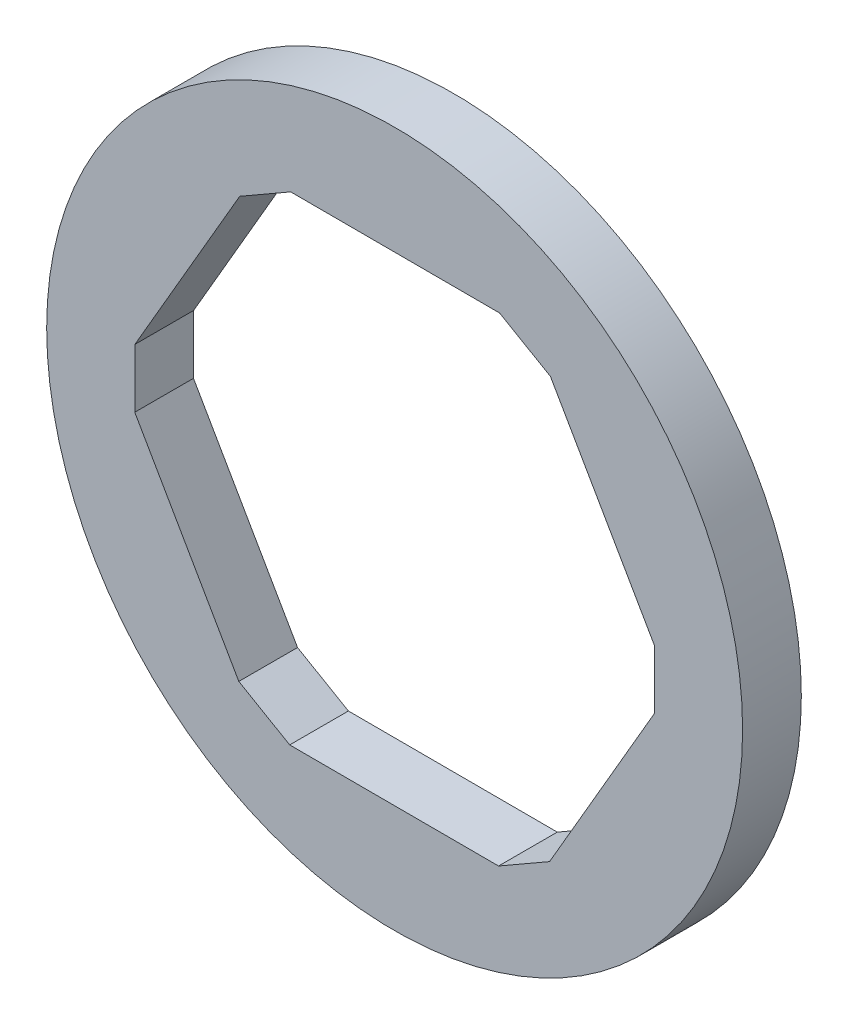
ISO-10303-21;
HEADER;
FILE_DESCRIPTION(('STEP AP214'),'2;1');
FILE_NAME('part.step','',(''),(''),'','','');
FILE_SCHEMA(('AUTOMOTIVE_DESIGN { 1 0 10303 214 1 1 1 1 }'));
ENDSEC;
DATA;
#1=APPLICATION_CONTEXT('core data for automotive mechanical design processes');
#2=APPLICATION_PROTOCOL_DEFINITION('international standard','automotive_design',2000,#1);
#3=PRODUCT_CONTEXT('',#1,'mechanical');
#4=PRODUCT('Part','Part','',(#3));
#5=PRODUCT_RELATED_PRODUCT_CATEGORY('part','',(#4));
#6=PRODUCT_DEFINITION_FORMATION('','',#4);
#7=PRODUCT_DEFINITION_CONTEXT('part definition',#1,'design');
#8=PRODUCT_DEFINITION('design','',#6,#7);
#9=PRODUCT_DEFINITION_SHAPE('','',#8);
#10=(LENGTH_UNIT() NAMED_UNIT(*) SI_UNIT(.MILLI.,.METRE.));
#11=(NAMED_UNIT(*) PLANE_ANGLE_UNIT() SI_UNIT($,.RADIAN.));
#12=(NAMED_UNIT(*) SI_UNIT($,.STERADIAN.) SOLID_ANGLE_UNIT());
#13=UNCERTAINTY_MEASURE_WITH_UNIT(LENGTH_MEASURE(1.E-05),#10,'distance_accuracy_value','');
#14=(GEOMETRIC_REPRESENTATION_CONTEXT(3) GLOBAL_UNCERTAINTY_ASSIGNED_CONTEXT((#13)) GLOBAL_UNIT_ASSIGNED_CONTEXT((#10,
#11,#12)) REPRESENTATION_CONTEXT('',''));
#15=CARTESIAN_POINT('',(0.,0.,0.));
#16=DIRECTION('',(0.,0.,1.));
#17=DIRECTION('',(1.,0.,0.));
#18=AXIS2_PLACEMENT_3D('',#15,#16,#17);
#19=CARTESIAN_POINT('',(0.,0.,1.563624));
#20=DIRECTION('',(0.,0.,1.));
#21=DIRECTION('',(1.,0.,0.));
#22=AXIS2_PLACEMENT_3D('',#19,#20,#21);
#23=PLANE('',#22);
#24=CARTESIAN_POINT('',(0.,0.,1.563624));
#25=DIRECTION('',(0.,0.,1.));
#26=DIRECTION('',(1.,0.,0.));
#27=AXIS2_PLACEMENT_3D('',#24,#25,#26);
#28=CIRCLE('',#27,9.26675750093145);
#29=CARTESIAN_POINT('',(9.26675750093145,0.,1.563624));
#30=VERTEX_POINT('',#29);
#31=EDGE_CURVE('E11',#30,#30,#28,.T.);
#32=ORIENTED_EDGE('',*,*,#31,.T.);
#33=EDGE_LOOP('',(#32));
#34=FACE_BOUND('',#33,.T.);
#35=DIRECTION('',(-0.867098131953429,-0.498137360135609,0.));
#36=VECTOR('',#35,1.);
#37=CARTESIAN_POINT('',(-2.76740923459767,6.38944280980686,1.563624));
#38=LINE('',#37,#36);
#39=CARTESIAN_POINT('',(-2.76740923459767,6.38944280980686,1.563624));
#40=VERTEX_POINT('',#39);
#41=CARTESIAN_POINT('',(-4.12564006629193,5.60915567041385,1.563624));
#42=VERTEX_POINT('',#41);
#43=EDGE_CURVE('E134',#40,#42,#38,.T.);
#44=ORIENTED_EDGE('',*,*,#43,.F.);
#45=DIRECTION('',(-0.999997689913506,0.0021494575251605,0.));
#46=VECTOR('',#45,1.);
#47=CARTESIAN_POINT('',(2.79485127121397,6.37748693948665,1.563624));
#48=LINE('',#47,#46);
#49=CARTESIAN_POINT('',(2.79485127121397,6.37748693948665,1.563624));
#50=VERTEX_POINT('',#49);
#51=EDGE_CURVE('E126',#50,#40,#48,.T.);
#52=ORIENTED_EDGE('',*,*,#51,.F.);
#53=DIRECTION('',(-0.864948674428269,0.501860329777898,0.));
#54=VECTOR('',#53,1.);
#55=CARTESIAN_POINT('',(4.14971517202173,5.59136810473267,1.563624));
#56=LINE('',#55,#54);
#57=CARTESIAN_POINT('',(4.14971517202173,5.59136810473267,1.563624));
#58=VERTEX_POINT('',#57);
#59=EDGE_CURVE('E166',#58,#50,#56,.T.);
#60=ORIENTED_EDGE('',*,*,#59,.F.);
#61=DIRECTION('',(-0.498137360135608,0.86709813195343,0.));
#62=VECTOR('',#61,1.);
#63=CARTESIAN_POINT('',(6.92049133750589,0.768331269072801,1.563624));
#64=LINE('',#63,#62);
#65=CARTESIAN_POINT('',(6.92049133750589,0.768331269072801,1.563624));
#66=VERTEX_POINT('',#65);
#67=EDGE_CURVE('E164',#66,#58,#64,.T.);
#68=ORIENTED_EDGE('',*,*,#67,.F.);
#69=DIRECTION('',(0.00214945752516037,0.999997689913506,0.));
#70=VECTOR('',#69,1.);
#71=CARTESIAN_POINT('',(6.91712440661941,-0.798074705074196,1.563624));
#72=LINE('',#71,#70);
#73=CARTESIAN_POINT('',(6.91712440661941,-0.798074705074196,1.563624));
#74=VERTEX_POINT('',#73);
#75=EDGE_CURVE('E162',#74,#66,#72,.T.);
#76=ORIENTED_EDGE('',*,*,#75,.F.);
#77=DIRECTION('',(0.501860329777897,0.864948674428269,0.));
#78=VECTOR('',#77,1.);
#79=CARTESIAN_POINT('',(4.12564006629192,-5.60915567041386,1.563624));
#80=LINE('',#79,#78);
#81=CARTESIAN_POINT('',(4.12564006629192,-5.60915567041386,1.563624));
#82=VERTEX_POINT('',#81);
#83=EDGE_CURVE('E160',#82,#74,#80,.T.);
#84=ORIENTED_EDGE('',*,*,#83,.F.);
#85=DIRECTION('',(0.86709813195343,0.498137360135608,0.));
#86=VECTOR('',#85,1.);
#87=CARTESIAN_POINT('',(2.76740923459767,-6.38944280980687,1.563624));
#88=LINE('',#87,#86);
#89=CARTESIAN_POINT('',(2.76740923459767,-6.38944280980687,1.563624));
#90=VERTEX_POINT('',#89);
#91=EDGE_CURVE('E158',#90,#82,#88,.T.);
#92=ORIENTED_EDGE('',*,*,#91,.F.);
#93=DIRECTION('',(0.999997689913506,-0.00214945752516082,0.));
#94=VECTOR('',#93,1.);
#95=CARTESIAN_POINT('',(-2.79485127121397,-6.37748693948665,1.563624));
#96=LINE('',#95,#94);
#97=CARTESIAN_POINT('',(-2.79485127121397,-6.37748693948665,1.563624));
#98=VERTEX_POINT('',#97);
#99=EDGE_CURVE('E156',#98,#90,#96,.T.);
#100=ORIENTED_EDGE('',*,*,#99,.F.);
#101=DIRECTION('',(0.86494867442827,-0.501860329777896,0.));
#102=VECTOR('',#101,1.);
#103=CARTESIAN_POINT('',(-4.14971517202173,-5.59136810473267,1.563624));
#104=LINE('',#103,#102);
#105=CARTESIAN_POINT('',(-4.14971517202173,-5.59136810473267,1.563624));
#106=VERTEX_POINT('',#105);
#107=EDGE_CURVE('E154',#106,#98,#104,.T.);
#108=ORIENTED_EDGE('',*,*,#107,.F.);
#109=DIRECTION('',(0.498137360135608,-0.86709813195343,0.));
#110=VECTOR('',#109,1.);
#111=CARTESIAN_POINT('',(-6.92049133750589,-0.768331269072805,1.563624));
#112=LINE('',#111,#110);
#113=CARTESIAN_POINT('',(-6.92049133750589,-0.768331269072805,1.563624));
#114=VERTEX_POINT('',#113);
#115=EDGE_CURVE('E152',#114,#106,#112,.T.);
#116=ORIENTED_EDGE('',*,*,#115,.F.);
#117=DIRECTION('',(-0.00214945752516037,-0.999997689913505,0.));
#118=VECTOR('',#117,1.);
#119=CARTESIAN_POINT('',(-6.91712440661941,0.798074705074193,1.563624));
#120=LINE('',#119,#118);
#121=CARTESIAN_POINT('',(-6.91712440661941,0.798074705074193,1.563624));
#122=VERTEX_POINT('',#121);
#123=EDGE_CURVE('E148',#122,#114,#120,.T.);
#124=ORIENTED_EDGE('',*,*,#123,.F.);
#125=DIRECTION('',(-0.501860329777897,-0.864948674428269,0.));
#126=VECTOR('',#125,1.);
#127=CARTESIAN_POINT('',(-4.12564006629193,5.60915567041385,1.563624));
#128=LINE('',#127,#126);
#129=EDGE_CURVE('E146',#42,#122,#128,.T.);
#130=ORIENTED_EDGE('',*,*,#129,.F.);
#131=EDGE_LOOP('',(#44,#52,#60,#68,#76,#84,#92,#100,#108,#116,#124,#130));
#132=FACE_BOUND('',#131,.T.);
#133=ADVANCED_FACE('F37',(#34,#132),#23,.T.);
#134=CARTESIAN_POINT('',(0.,0.,0.));
#135=DIRECTION('',(0.,0.,1.));
#136=DIRECTION('',(1.,0.,0.));
#137=AXIS2_PLACEMENT_3D('',#134,#135,#136);
#138=PLANE('',#137);
#139=CARTESIAN_POINT('',(0.,0.,0.));
#140=DIRECTION('',(0.,0.,1.));
#141=DIRECTION('',(1.,0.,0.));
#142=AXIS2_PLACEMENT_3D('',#139,#140,#141);
#143=CIRCLE('',#142,9.26675750093145);
#144=CARTESIAN_POINT('',(9.26675750093145,0.,0.));
#145=VERTEX_POINT('',#144);
#146=EDGE_CURVE('E41',#145,#145,#143,.T.);
#147=ORIENTED_EDGE('',*,*,#146,.F.);
#148=EDGE_LOOP('',(#147));
#149=FACE_BOUND('',#148,.T.);
#150=DIRECTION('',(-0.999997689913506,0.0021494575251605,0.));
#151=VECTOR('',#150,1.);
#152=CARTESIAN_POINT('',(2.79485127121397,6.37748693948665,0.));
#153=LINE('',#152,#151);
#154=CARTESIAN_POINT('',(2.79485127121397,6.37748693948665,0.));
#155=VERTEX_POINT('',#154);
#156=CARTESIAN_POINT('',(-2.76740923459767,6.38944280980686,0.));
#157=VERTEX_POINT('',#156);
#158=EDGE_CURVE('E60',#155,#157,#153,.T.);
#159=ORIENTED_EDGE('',*,*,#158,.T.);
#160=DIRECTION('',(-0.867098131953429,-0.498137360135609,0.));
#161=VECTOR('',#160,1.);
#162=CARTESIAN_POINT('',(-2.76740923459767,6.38944280980686,0.));
#163=LINE('',#162,#161);
#164=CARTESIAN_POINT('',(-4.12564006629193,5.60915567041385,0.));
#165=VERTEX_POINT('',#164);
#166=EDGE_CURVE('E141',#157,#165,#163,.T.);
#167=ORIENTED_EDGE('',*,*,#166,.T.);
#168=DIRECTION('',(-0.501860329777897,-0.864948674428269,0.));
#169=VECTOR('',#168,1.);
#170=CARTESIAN_POINT('',(-4.12564006629193,5.60915567041385,0.));
#171=LINE('',#170,#169);
#172=CARTESIAN_POINT('',(-6.91712440661941,0.798074705074193,0.));
#173=VERTEX_POINT('',#172);
#174=EDGE_CURVE('E170',#165,#173,#171,.T.);
#175=ORIENTED_EDGE('',*,*,#174,.T.);
#176=DIRECTION('',(-0.00214945752516037,-0.999997689913505,0.));
#177=VECTOR('',#176,1.);
#178=CARTESIAN_POINT('',(-6.91712440661941,0.798074705074193,0.));
#179=LINE('',#178,#177);
#180=CARTESIAN_POINT('',(-6.92049133750589,-0.768331269072805,0.));
#181=VERTEX_POINT('',#180);
#182=EDGE_CURVE('E173',#173,#181,#179,.T.);
#183=ORIENTED_EDGE('',*,*,#182,.T.);
#184=DIRECTION('',(0.498137360135608,-0.86709813195343,0.));
#185=VECTOR('',#184,1.);
#186=CARTESIAN_POINT('',(-6.92049133750589,-0.768331269072805,0.));
#187=LINE('',#186,#185);
#188=CARTESIAN_POINT('',(-4.14971517202173,-5.59136810473267,0.));
#189=VERTEX_POINT('',#188);
#190=EDGE_CURVE('E176',#181,#189,#187,.T.);
#191=ORIENTED_EDGE('',*,*,#190,.T.);
#192=DIRECTION('',(0.86494867442827,-0.501860329777896,0.));
#193=VECTOR('',#192,1.);
#194=CARTESIAN_POINT('',(-4.14971517202173,-5.59136810473267,0.));
#195=LINE('',#194,#193);
#196=CARTESIAN_POINT('',(-2.79485127121397,-6.37748693948665,0.));
#197=VERTEX_POINT('',#196);
#198=EDGE_CURVE('E179',#189,#197,#195,.T.);
#199=ORIENTED_EDGE('',*,*,#198,.T.);
#200=DIRECTION('',(0.999997689913506,-0.00214945752516082,0.));
#201=VECTOR('',#200,1.);
#202=CARTESIAN_POINT('',(-2.79485127121397,-6.37748693948665,0.));
#203=LINE('',#202,#201);
#204=CARTESIAN_POINT('',(2.76740923459767,-6.38944280980687,0.));
#205=VERTEX_POINT('',#204);
#206=EDGE_CURVE('E182',#197,#205,#203,.T.);
#207=ORIENTED_EDGE('',*,*,#206,.T.);
#208=DIRECTION('',(0.86709813195343,0.498137360135608,0.));
#209=VECTOR('',#208,1.);
#210=CARTESIAN_POINT('',(2.76740923459767,-6.38944280980687,0.));
#211=LINE('',#210,#209);
#212=CARTESIAN_POINT('',(4.12564006629192,-5.60915567041386,0.));
#213=VERTEX_POINT('',#212);
#214=EDGE_CURVE('E185',#205,#213,#211,.T.);
#215=ORIENTED_EDGE('',*,*,#214,.T.);
#216=DIRECTION('',(0.501860329777897,0.864948674428269,0.));
#217=VECTOR('',#216,1.);
#218=CARTESIAN_POINT('',(4.12564006629192,-5.60915567041386,0.));
#219=LINE('',#218,#217);
#220=CARTESIAN_POINT('',(6.91712440661941,-0.798074705074196,0.));
#221=VERTEX_POINT('',#220);
#222=EDGE_CURVE('E188',#213,#221,#219,.T.);
#223=ORIENTED_EDGE('',*,*,#222,.T.);
#224=DIRECTION('',(0.00214945752516037,0.999997689913506,0.));
#225=VECTOR('',#224,1.);
#226=CARTESIAN_POINT('',(6.91712440661941,-0.798074705074196,0.));
#227=LINE('',#226,#225);
#228=CARTESIAN_POINT('',(6.92049133750589,0.768331269072801,0.));
#229=VERTEX_POINT('',#228);
#230=EDGE_CURVE('E191',#221,#229,#227,.T.);
#231=ORIENTED_EDGE('',*,*,#230,.T.);
#232=DIRECTION('',(-0.498137360135608,0.86709813195343,0.));
#233=VECTOR('',#232,1.);
#234=CARTESIAN_POINT('',(6.92049133750589,0.768331269072801,0.));
#235=LINE('',#234,#233);
#236=CARTESIAN_POINT('',(4.14971517202173,5.59136810473267,0.));
#237=VERTEX_POINT('',#236);
#238=EDGE_CURVE('E194',#229,#237,#235,.T.);
#239=ORIENTED_EDGE('',*,*,#238,.T.);
#240=DIRECTION('',(-0.864948674428269,0.501860329777898,0.));
#241=VECTOR('',#240,1.);
#242=CARTESIAN_POINT('',(4.14971517202173,5.59136810473267,0.));
#243=LINE('',#242,#241);
#244=EDGE_CURVE('E135',#237,#155,#243,.T.);
#245=ORIENTED_EDGE('',*,*,#244,.T.);
#246=EDGE_LOOP('',(#159,#167,#175,#183,#191,#199,#207,#215,#223,#231,#239,#245));
#247=FACE_BOUND('',#246,.T.);
#248=ADVANCED_FACE('F223',(#149,#247),#138,.F.);
#249=CARTESIAN_POINT('',(0.,0.,1.563624));
#250=DIRECTION('',(0.,0.,-1.));
#251=DIRECTION('',(-1.,0.,0.));
#252=AXIS2_PLACEMENT_3D('',#249,#250,#251);
#253=CYLINDRICAL_SURFACE('',#252,9.26675750093145);
#254=ORIENTED_EDGE('',*,*,#31,.F.);
#255=EDGE_LOOP('',(#254));
#256=FACE_BOUND('',#255,.T.);
#257=ORIENTED_EDGE('',*,*,#146,.T.);
#258=EDGE_LOOP('',(#257));
#259=FACE_BOUND('',#258,.T.);
#260=ADVANCED_FACE('F39',(#256,#259),#253,.T.);
#261=CARTESIAN_POINT('',(2.79485127121397,6.37748693948665,1.563624));
#262=DIRECTION('',(-0.0021494575251605,-0.999997689913505,0.));
#263=DIRECTION('',(0.999997689913506,-0.0021494575251605,0.));
#264=AXIS2_PLACEMENT_3D('',#261,#262,#263);
#265=PLANE('',#264);
#266=ORIENTED_EDGE('',*,*,#158,.F.);
#267=DIRECTION('',(0.,0.,-1.));
#268=VECTOR('',#267,1.);
#269=CARTESIAN_POINT('',(2.79485127121397,6.37748693948665,1.563624));
#270=LINE('',#269,#268);
#271=EDGE_CURVE('E130',#50,#155,#270,.T.);
#272=ORIENTED_EDGE('',*,*,#271,.F.);
#273=ORIENTED_EDGE('',*,*,#51,.T.);
#274=DIRECTION('',(0.,0.,-1.));
#275=VECTOR('',#274,1.);
#276=CARTESIAN_POINT('',(-2.76740923459767,6.38944280980686,1.563624));
#277=LINE('',#276,#275);
#278=EDGE_CURVE('E129',#40,#157,#277,.T.);
#279=ORIENTED_EDGE('',*,*,#278,.T.);
#280=EDGE_LOOP('',(#266,#272,#273,#279));
#281=FACE_BOUND('',#280,.T.);
#282=ADVANCED_FACE('F128',(#281),#265,.T.);
#283=CARTESIAN_POINT('',(-2.76740923459767,6.38944280980686,1.563624));
#284=DIRECTION('',(0.498137360135609,-0.86709813195343,0.));
#285=DIRECTION('',(0.86709813195343,0.498137360135609,0.));
#286=AXIS2_PLACEMENT_3D('',#283,#284,#285);
#287=PLANE('',#286);
#288=ORIENTED_EDGE('',*,*,#166,.F.);
#289=ORIENTED_EDGE('',*,*,#278,.F.);
#290=ORIENTED_EDGE('',*,*,#43,.T.);
#291=DIRECTION('',(0.,0.,-1.));
#292=VECTOR('',#291,1.);
#293=CARTESIAN_POINT('',(-4.12564006629193,5.60915567041385,1.563624));
#294=LINE('',#293,#292);
#295=EDGE_CURVE('E142',#42,#165,#294,.T.);
#296=ORIENTED_EDGE('',*,*,#295,.T.);
#297=EDGE_LOOP('',(#288,#289,#290,#296));
#298=FACE_BOUND('',#297,.T.);
#299=ADVANCED_FACE('F138',(#298),#287,.T.);
#300=CARTESIAN_POINT('',(-4.12564006629193,5.60915567041385,1.563624));
#301=DIRECTION('',(0.86494867442827,-0.501860329777897,0.));
#302=DIRECTION('',(0.501860329777897,0.86494867442827,0.));
#303=AXIS2_PLACEMENT_3D('',#300,#301,#302);
#304=PLANE('',#303);
#305=ORIENTED_EDGE('',*,*,#174,.F.);
#306=ORIENTED_EDGE('',*,*,#295,.F.);
#307=ORIENTED_EDGE('',*,*,#129,.T.);
#308=DIRECTION('',(0.,0.,-1.));
#309=VECTOR('',#308,1.);
#310=CARTESIAN_POINT('',(-6.91712440661941,0.798074705074193,1.563624));
#311=LINE('',#310,#309);
#312=EDGE_CURVE('E215',#122,#173,#311,.T.);
#313=ORIENTED_EDGE('',*,*,#312,.T.);
#314=EDGE_LOOP('',(#305,#306,#307,#313));
#315=FACE_BOUND('',#314,.T.);
#316=ADVANCED_FACE('F219',(#315),#304,.T.);
#317=CARTESIAN_POINT('',(-6.91712440661941,0.798074705074193,1.563624));
#318=DIRECTION('',(0.999997689913506,-0.00214945752516037,0.));
#319=DIRECTION('',(0.00214945752516037,0.999997689913505,0.));
#320=AXIS2_PLACEMENT_3D('',#317,#318,#319);
#321=PLANE('',#320);
#322=ORIENTED_EDGE('',*,*,#182,.F.);
#323=ORIENTED_EDGE('',*,*,#312,.F.);
#324=ORIENTED_EDGE('',*,*,#123,.T.);
#325=DIRECTION('',(0.,0.,-1.));
#326=VECTOR('',#325,1.);
#327=CARTESIAN_POINT('',(-6.92049133750589,-0.768331269072805,1.563624));
#328=LINE('',#327,#326);
#329=EDGE_CURVE('E213',#114,#181,#328,.T.);
#330=ORIENTED_EDGE('',*,*,#329,.T.);
#331=EDGE_LOOP('',(#322,#323,#324,#330));
#332=FACE_BOUND('',#331,.T.);
#333=ADVANCED_FACE('F261',(#332),#321,.T.);
#334=CARTESIAN_POINT('',(-6.92049133750589,-0.768331269072805,1.563624));
#335=DIRECTION('',(0.86709813195343,0.498137360135608,0.));
#336=DIRECTION('',(-0.498137360135608,0.86709813195343,0.));
#337=AXIS2_PLACEMENT_3D('',#334,#335,#336);
#338=PLANE('',#337);
#339=ORIENTED_EDGE('',*,*,#190,.F.);
#340=ORIENTED_EDGE('',*,*,#329,.F.);
#341=ORIENTED_EDGE('',*,*,#115,.T.);
#342=DIRECTION('',(0.,0.,-1.));
#343=VECTOR('',#342,1.);
#344=CARTESIAN_POINT('',(-4.14971517202173,-5.59136810473267,1.563624));
#345=LINE('',#344,#343);
#346=EDGE_CURVE('E211',#106,#189,#345,.T.);
#347=ORIENTED_EDGE('',*,*,#346,.T.);
#348=EDGE_LOOP('',(#339,#340,#341,#347));
#349=FACE_BOUND('',#348,.T.);
#350=ADVANCED_FACE('F259',(#349),#338,.T.);
#351=CARTESIAN_POINT('',(-4.14971517202173,-5.59136810473267,1.563624));
#352=DIRECTION('',(0.501860329777896,0.86494867442827,0.));
#353=DIRECTION('',(-0.86494867442827,0.501860329777896,0.));
#354=AXIS2_PLACEMENT_3D('',#351,#352,#353);
#355=PLANE('',#354);
#356=ORIENTED_EDGE('',*,*,#198,.F.);
#357=ORIENTED_EDGE('',*,*,#346,.F.);
#358=ORIENTED_EDGE('',*,*,#107,.T.);
#359=DIRECTION('',(0.,0.,-1.));
#360=VECTOR('',#359,1.);
#361=CARTESIAN_POINT('',(-2.79485127121397,-6.37748693948665,1.563624));
#362=LINE('',#361,#360);
#363=EDGE_CURVE('E209',#98,#197,#362,.T.);
#364=ORIENTED_EDGE('',*,*,#363,.T.);
#365=EDGE_LOOP('',(#356,#357,#358,#364));
#366=FACE_BOUND('',#365,.T.);
#367=ADVANCED_FACE('F253',(#366),#355,.T.);
#368=CARTESIAN_POINT('',(-2.79485127121397,-6.37748693948665,1.563624));
#369=DIRECTION('',(0.00214945752516082,0.999997689913505,0.));
#370=DIRECTION('',(-0.999997689913506,0.00214945752516082,0.));
#371=AXIS2_PLACEMENT_3D('',#368,#369,#370);
#372=PLANE('',#371);
#373=ORIENTED_EDGE('',*,*,#206,.F.);
#374=ORIENTED_EDGE('',*,*,#363,.F.);
#375=ORIENTED_EDGE('',*,*,#99,.T.);
#376=DIRECTION('',(0.,0.,-1.));
#377=VECTOR('',#376,1.);
#378=CARTESIAN_POINT('',(2.76740923459767,-6.38944280980687,1.563624));
#379=LINE('',#378,#377);
#380=EDGE_CURVE('E207',#90,#205,#379,.T.);
#381=ORIENTED_EDGE('',*,*,#380,.T.);
#382=EDGE_LOOP('',(#373,#374,#375,#381));
#383=FACE_BOUND('',#382,.T.);
#384=ADVANCED_FACE('F249',(#383),#372,.T.);
#385=CARTESIAN_POINT('',(2.76740923459767,-6.38944280980687,1.563624));
#386=DIRECTION('',(-0.498137360135608,0.86709813195343,0.));
#387=DIRECTION('',(-0.86709813195343,-0.498137360135608,0.));
#388=AXIS2_PLACEMENT_3D('',#385,#386,#387);
#389=PLANE('',#388);
#390=ORIENTED_EDGE('',*,*,#214,.F.);
#391=ORIENTED_EDGE('',*,*,#380,.F.);
#392=ORIENTED_EDGE('',*,*,#91,.T.);
#393=DIRECTION('',(0.,0.,-1.));
#394=VECTOR('',#393,1.);
#395=CARTESIAN_POINT('',(4.12564006629192,-5.60915567041386,1.563624));
#396=LINE('',#395,#394);
#397=EDGE_CURVE('E205',#82,#213,#396,.T.);
#398=ORIENTED_EDGE('',*,*,#397,.T.);
#399=EDGE_LOOP('',(#390,#391,#392,#398));
#400=FACE_BOUND('',#399,.T.);
#401=ADVANCED_FACE('F246',(#400),#389,.T.);
#402=CARTESIAN_POINT('',(4.12564006629192,-5.60915567041386,1.563624));
#403=DIRECTION('',(-0.864948674428269,0.501860329777897,0.));
#404=DIRECTION('',(-0.501860329777897,-0.864948674428269,0.));
#405=AXIS2_PLACEMENT_3D('',#402,#403,#404);
#406=PLANE('',#405);
#407=ORIENTED_EDGE('',*,*,#222,.F.);
#408=ORIENTED_EDGE('',*,*,#397,.F.);
#409=ORIENTED_EDGE('',*,*,#83,.T.);
#410=DIRECTION('',(0.,0.,-1.));
#411=VECTOR('',#410,1.);
#412=CARTESIAN_POINT('',(6.91712440661941,-0.798074705074196,1.563624));
#413=LINE('',#412,#411);
#414=EDGE_CURVE('E203',#74,#221,#413,.T.);
#415=ORIENTED_EDGE('',*,*,#414,.T.);
#416=EDGE_LOOP('',(#407,#408,#409,#415));
#417=FACE_BOUND('',#416,.T.);
#418=ADVANCED_FACE('F238',(#417),#406,.T.);
#419=CARTESIAN_POINT('',(6.91712440661941,-0.798074705074196,1.563624));
#420=DIRECTION('',(-0.999997689913505,0.00214945752516037,0.));
#421=DIRECTION('',(-0.00214945752516037,-0.999997689913506,0.));
#422=AXIS2_PLACEMENT_3D('',#419,#420,#421);
#423=PLANE('',#422);
#424=ORIENTED_EDGE('',*,*,#230,.F.);
#425=ORIENTED_EDGE('',*,*,#414,.F.);
#426=ORIENTED_EDGE('',*,*,#75,.T.);
#427=DIRECTION('',(0.,0.,-1.));
#428=VECTOR('',#427,1.);
#429=CARTESIAN_POINT('',(6.92049133750589,0.768331269072801,1.563624));
#430=LINE('',#429,#428);
#431=EDGE_CURVE('E201',#66,#229,#430,.T.);
#432=ORIENTED_EDGE('',*,*,#431,.T.);
#433=EDGE_LOOP('',(#424,#425,#426,#432));
#434=FACE_BOUND('',#433,.T.);
#435=ADVANCED_FACE('F234',(#434),#423,.T.);
#436=CARTESIAN_POINT('',(6.92049133750589,0.768331269072801,1.563624));
#437=DIRECTION('',(-0.86709813195343,-0.498137360135608,0.));
#438=DIRECTION('',(0.498137360135608,-0.86709813195343,0.));
#439=AXIS2_PLACEMENT_3D('',#436,#437,#438);
#440=PLANE('',#439);
#441=ORIENTED_EDGE('',*,*,#238,.F.);
#442=ORIENTED_EDGE('',*,*,#431,.F.);
#443=ORIENTED_EDGE('',*,*,#67,.T.);
#444=DIRECTION('',(0.,0.,-1.));
#445=VECTOR('',#444,1.);
#446=CARTESIAN_POINT('',(4.14971517202173,5.59136810473267,1.563624));
#447=LINE('',#446,#445);
#448=EDGE_CURVE('E52',#58,#237,#447,.T.);
#449=ORIENTED_EDGE('',*,*,#448,.T.);
#450=EDGE_LOOP('',(#441,#442,#443,#449));
#451=FACE_BOUND('',#450,.T.);
#452=ADVANCED_FACE('F231',(#451),#440,.T.);
#453=CARTESIAN_POINT('',(4.14971517202173,5.59136810473267,1.563624));
#454=DIRECTION('',(-0.501860329777898,-0.864948674428269,0.));
#455=DIRECTION('',(0.864948674428269,-0.501860329777898,0.));
#456=AXIS2_PLACEMENT_3D('',#453,#454,#455);
#457=PLANE('',#456);
#458=ORIENTED_EDGE('',*,*,#244,.F.);
#459=ORIENTED_EDGE('',*,*,#448,.F.);
#460=ORIENTED_EDGE('',*,*,#59,.T.);
#461=ORIENTED_EDGE('',*,*,#271,.T.);
#462=EDGE_LOOP('',(#458,#459,#460,#461));
#463=FACE_BOUND('',#462,.T.);
#464=ADVANCED_FACE('F225',(#463),#457,.T.);
#465=CLOSED_SHELL('',(#133,#248,#260,#282,#299,#316,#333,#350,#367,#384,#401,#418,#435,#452,#464));
#466=MANIFOLD_SOLID_BREP('B2',#465);
#467=ADVANCED_BREP_SHAPE_REPRESENTATION('',(#18,#466),#14);
#468=SHAPE_DEFINITION_REPRESENTATION(#9,#467);
ENDSEC;
END-ISO-10303-21;
